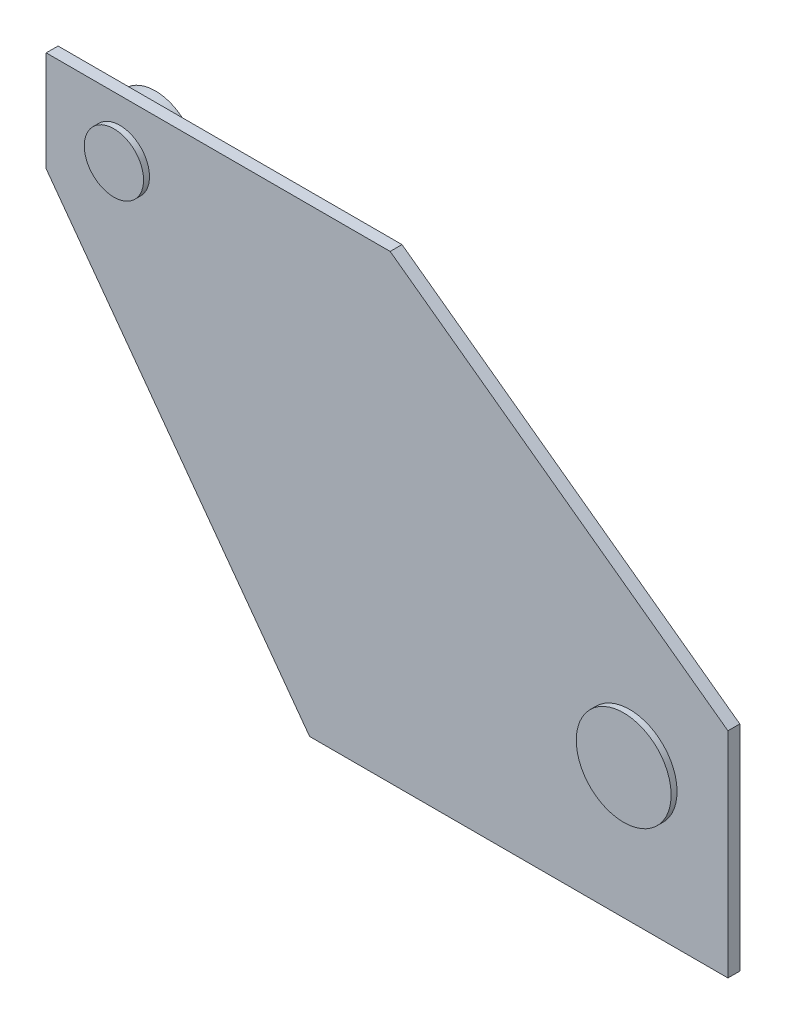
ISO-10303-21;
HEADER;
FILE_DESCRIPTION(('STEP AP214'),'2;1');
FILE_NAME('part.step','',(''),(''),'','','');
FILE_SCHEMA(('AUTOMOTIVE_DESIGN { 1 0 10303 214 1 1 1 1 }'));
ENDSEC;
DATA;
#1=APPLICATION_CONTEXT('core data for automotive mechanical design processes');
#2=APPLICATION_PROTOCOL_DEFINITION('international standard','automotive_design',2000,#1);
#3=PRODUCT_CONTEXT('',#1,'mechanical');
#4=PRODUCT('Part','Part','',(#3));
#5=PRODUCT_RELATED_PRODUCT_CATEGORY('part','',(#4));
#6=PRODUCT_DEFINITION_FORMATION('','',#4);
#7=PRODUCT_DEFINITION_CONTEXT('part definition',#1,'design');
#8=PRODUCT_DEFINITION('design','',#6,#7);
#9=PRODUCT_DEFINITION_SHAPE('','',#8);
#10=(LENGTH_UNIT() NAMED_UNIT(*) SI_UNIT(.MILLI.,.METRE.));
#11=(NAMED_UNIT(*) PLANE_ANGLE_UNIT() SI_UNIT($,.RADIAN.));
#12=(NAMED_UNIT(*) SI_UNIT($,.STERADIAN.) SOLID_ANGLE_UNIT());
#13=UNCERTAINTY_MEASURE_WITH_UNIT(LENGTH_MEASURE(1.E-05),#10,'distance_accuracy_value','');
#14=(GEOMETRIC_REPRESENTATION_CONTEXT(3) GLOBAL_UNCERTAINTY_ASSIGNED_CONTEXT((#13)) GLOBAL_UNIT_ASSIGNED_CONTEXT((#10,
#11,#12)) REPRESENTATION_CONTEXT('',''));
#15=CARTESIAN_POINT('',(0.,0.,0.));
#16=DIRECTION('',(0.,0.,1.));
#17=DIRECTION('',(1.,0.,0.));
#18=AXIS2_PLACEMENT_3D('',#15,#16,#17);
#19=CARTESIAN_POINT('',(179.691190027265,88.518654731376,21.605));
#20=DIRECTION('',(1.,0.,0.));
#21=DIRECTION('',(0.,0.,-1.));
#22=AXIS2_PLACEMENT_3D('',#19,#20,#21);
#23=PLANE('',#22);
#24=DIRECTION('',(0.,0.,-1.));
#25=VECTOR('',#24,1.);
#26=CARTESIAN_POINT('',(179.691190027265,65.5884816943821,21.605));
#27=LINE('',#26,#25);
#28=CARTESIAN_POINT('',(179.691190027265,65.5884816943821,17.145));
#29=VERTEX_POINT('',#28);
#30=CARTESIAN_POINT('',(179.691190027265,65.5884816943821,15.875));
#31=VERTEX_POINT('',#30);
#32=EDGE_CURVE('E139',#29,#31,#27,.T.);
#33=ORIENTED_EDGE('',*,*,#32,.T.);
#34=DIRECTION('',(0.,1.,0.));
#35=VECTOR('',#34,1.);
#36=CARTESIAN_POINT('',(179.691190027265,95.25,15.875));
#37=LINE('',#36,#35);
#38=CARTESIAN_POINT('',(179.691190027265,88.518654731376,15.875));
#39=VERTEX_POINT('',#38);
#40=EDGE_CURVE('E115',#31,#39,#37,.T.);
#41=ORIENTED_EDGE('',*,*,#40,.T.);
#42=DIRECTION('',(0.,0.,-1.));
#43=VECTOR('',#42,1.);
#44=CARTESIAN_POINT('',(179.691190027265,88.518654731376,21.605));
#45=LINE('',#44,#43);
#46=CARTESIAN_POINT('',(179.691190027265,88.518654731376,17.145));
#47=VERTEX_POINT('',#46);
#48=EDGE_CURVE('E43',#47,#39,#45,.T.);
#49=ORIENTED_EDGE('',*,*,#48,.F.);
#50=DIRECTION('',(0.,1.,0.));
#51=VECTOR('',#50,1.);
#52=CARTESIAN_POINT('',(179.691190027265,73.2864974747366,17.145));
#53=LINE('',#52,#51);
#54=EDGE_CURVE('E132',#29,#47,#53,.T.);
#55=ORIENTED_EDGE('',*,*,#54,.F.);
#56=EDGE_LOOP('',(#33,#41,#49,#55));
#57=FACE_BOUND('',#56,.T.);
#58=ADVANCED_FACE('F39',(#57),#23,.T.);
#59=CARTESIAN_POINT('',(143.514301236525,114.889871939466,21.605));
#60=DIRECTION('',(0.589058923049427,0.808090084814713,0.));
#61=DIRECTION('',(-0.808090084814713,0.589058923049427,0.));
#62=AXIS2_PLACEMENT_3D('',#59,#60,#61);
#63=PLANE('',#62);
#64=ORIENTED_EDGE('',*,*,#48,.T.);
#65=DIRECTION('',(-0.808090084814713,0.589058923049427,0.));
#66=VECTOR('',#65,1.);
#67=CARTESIAN_POINT('',(59.1469148995483,176.389651073063,15.875));
#68=LINE('',#67,#66);
#69=CARTESIAN_POINT('',(143.514301236525,114.889871939466,15.875));
#70=VERTEX_POINT('',#69);
#71=EDGE_CURVE('E108',#39,#70,#68,.T.);
#72=ORIENTED_EDGE('',*,*,#71,.T.);
#73=DIRECTION('',(0.,0.,-1.));
#74=VECTOR('',#73,1.);
#75=CARTESIAN_POINT('',(143.514301236525,114.889871939466,21.605));
#76=LINE('',#75,#74);
#77=CARTESIAN_POINT('',(143.514301236525,114.889871939466,17.145));
#78=VERTEX_POINT('',#77);
#79=EDGE_CURVE('E93',#78,#70,#76,.T.);
#80=ORIENTED_EDGE('',*,*,#79,.F.);
#81=DIRECTION('',(-0.808090084814713,0.589058923049427,0.));
#82=VECTOR('',#81,1.);
#83=CARTESIAN_POINT('',(161.167664680989,102.021416486037,17.145));
#84=LINE('',#83,#82);
#85=EDGE_CURVE('E55',#47,#78,#84,.T.);
#86=ORIENTED_EDGE('',*,*,#85,.F.);
#87=EDGE_LOOP('',(#64,#72,#80,#86));
#88=FACE_BOUND('',#87,.T.);
#89=ADVANCED_FACE('F41',(#88),#63,.T.);
#90=CARTESIAN_POINT('',(106.680223984281,114.889871939466,21.605));
#91=DIRECTION('',(0.,1.,0.));
#92=DIRECTION('',(0.,0.,1.));
#93=AXIS2_PLACEMENT_3D('',#90,#91,#92);
#94=PLANE('',#93);
#95=ORIENTED_EDGE('',*,*,#79,.T.);
#96=DIRECTION('',(-1.,0.,0.));
#97=VECTOR('',#96,1.);
#98=CARTESIAN_POINT('',(0.,114.889871939466,15.875));
#99=LINE('',#98,#97);
#100=CARTESIAN_POINT('',(106.680223984281,114.889871939466,15.875));
#101=VERTEX_POINT('',#100);
#102=EDGE_CURVE('E97',#70,#101,#99,.T.);
#103=ORIENTED_EDGE('',*,*,#102,.T.);
#104=DIRECTION('',(0.,0.,-1.));
#105=VECTOR('',#104,1.);
#106=CARTESIAN_POINT('',(106.680223984281,114.889871939466,21.605));
#107=LINE('',#106,#105);
#108=CARTESIAN_POINT('',(106.680223984281,114.889871939466,17.145));
#109=VERTEX_POINT('',#108);
#110=EDGE_CURVE('E102',#109,#101,#107,.T.);
#111=ORIENTED_EDGE('',*,*,#110,.F.);
#112=DIRECTION('',(-1.,0.,0.));
#113=VECTOR('',#112,1.);
#114=CARTESIAN_POINT('',(140.221286591732,114.889871939466,17.145));
#115=LINE('',#114,#113);
#116=EDGE_CURVE('E12',#78,#109,#115,.T.);
#117=ORIENTED_EDGE('',*,*,#116,.F.);
#118=EDGE_LOOP('',(#95,#103,#111,#117));
#119=FACE_BOUND('',#118,.T.);
#120=ADVANCED_FACE('F95',(#119),#94,.T.);
#121=CARTESIAN_POINT('',(106.680223984281,104.130713951506,21.605));
#122=DIRECTION('',(-1.,0.,0.));
#123=DIRECTION('',(0.,0.,1.));
#124=AXIS2_PLACEMENT_3D('',#121,#122,#123);
#125=PLANE('',#124);
#126=ORIENTED_EDGE('',*,*,#110,.T.);
#127=DIRECTION('',(0.,-1.,0.));
#128=VECTOR('',#127,1.);
#129=CARTESIAN_POINT('',(106.680223984281,95.25,15.875));
#130=LINE('',#129,#128);
#131=CARTESIAN_POINT('',(106.680223984281,104.130713951506,15.875));
#132=VERTEX_POINT('',#131);
#133=EDGE_CURVE('E111',#101,#132,#130,.T.);
#134=ORIENTED_EDGE('',*,*,#133,.T.);
#135=DIRECTION('',(0.,0.,-1.));
#136=VECTOR('',#135,1.);
#137=CARTESIAN_POINT('',(106.680223984281,104.130713951506,21.605));
#138=LINE('',#137,#136);
#139=CARTESIAN_POINT('',(106.680223984281,104.130713951506,17.145));
#140=VERTEX_POINT('',#139);
#141=EDGE_CURVE('E101',#140,#132,#138,.T.);
#142=ORIENTED_EDGE('',*,*,#141,.F.);
#143=DIRECTION('',(0.,-1.,0.));
#144=VECTOR('',#143,1.);
#145=CARTESIAN_POINT('',(106.680223984281,73.2864974747366,17.145));
#146=LINE('',#145,#144);
#147=EDGE_CURVE('E48',#109,#140,#146,.T.);
#148=ORIENTED_EDGE('',*,*,#147,.F.);
#149=EDGE_LOOP('',(#126,#134,#142,#148));
#150=FACE_BOUND('',#149,.T.);
#151=ADVANCED_FACE('F179',(#150),#125,.T.);
#152=CARTESIAN_POINT('',(134.890546490372,65.5884816943821,21.605));
#153=DIRECTION('',(-0.80694362065516,-0.590628472970903,0.));
#154=DIRECTION('',(0.590628472970903,-0.80694362065516,0.));
#155=AXIS2_PLACEMENT_3D('',#152,#153,#154);
#156=PLANE('',#155);
#157=ORIENTED_EDGE('',*,*,#141,.T.);
#158=DIRECTION('',(0.590628472970903,-0.80694362065516,0.));
#159=VECTOR('',#158,1.);
#160=CARTESIAN_POINT('',(73.6982647395772,149.192174458732,15.875));
#161=LINE('',#160,#159);
#162=CARTESIAN_POINT('',(134.890546490372,65.5884816943821,15.875));
#163=VERTEX_POINT('',#162);
#164=EDGE_CURVE('E170',#132,#163,#161,.T.);
#165=ORIENTED_EDGE('',*,*,#164,.T.);
#166=DIRECTION('',(0.,0.,-1.));
#167=VECTOR('',#166,1.);
#168=CARTESIAN_POINT('',(134.890546490372,65.5884816943821,21.605));
#169=LINE('',#168,#167);
#170=CARTESIAN_POINT('',(134.890546490372,65.5884816943821,17.145));
#171=VERTEX_POINT('',#170);
#172=EDGE_CURVE('E138',#171,#163,#169,.T.);
#173=ORIENTED_EDGE('',*,*,#172,.F.);
#174=DIRECTION('',(0.590628472970903,-0.80694362065516,0.));
#175=VECTOR('',#174,1.);
#176=CARTESIAN_POINT('',(133.081228314724,68.060454899856,17.145));
#177=LINE('',#176,#175);
#178=EDGE_CURVE('E126',#140,#171,#177,.T.);
#179=ORIENTED_EDGE('',*,*,#178,.F.);
#180=EDGE_LOOP('',(#157,#165,#173,#179));
#181=FACE_BOUND('',#180,.T.);
#182=ADVANCED_FACE('F178',(#181),#156,.T.);
#183=CARTESIAN_POINT('',(179.691190027265,65.5884816943821,21.605));
#184=DIRECTION('',(0.,-1.,0.));
#185=DIRECTION('',(0.,0.,-1.));
#186=AXIS2_PLACEMENT_3D('',#183,#184,#185);
#187=PLANE('',#186);
#188=ORIENTED_EDGE('',*,*,#172,.T.);
#189=DIRECTION('',(1.,0.,0.));
#190=VECTOR('',#189,1.);
#191=CARTESIAN_POINT('',(0.,65.5884816943821,15.875));
#192=LINE('',#191,#190);
#193=EDGE_CURVE('E118',#163,#31,#192,.T.);
#194=ORIENTED_EDGE('',*,*,#193,.T.);
#195=ORIENTED_EDGE('',*,*,#32,.F.);
#196=DIRECTION('',(1.,0.,0.));
#197=VECTOR('',#196,1.);
#198=CARTESIAN_POINT('',(140.221286591732,65.5884816943821,17.145));
#199=LINE('',#198,#197);
#200=EDGE_CURVE('E129',#171,#29,#199,.T.);
#201=ORIENTED_EDGE('',*,*,#200,.F.);
#202=EDGE_LOOP('',(#188,#194,#195,#201));
#203=FACE_BOUND('',#202,.T.);
#204=ADVANCED_FACE('F174',(#203),#187,.T.);
#205=CARTESIAN_POINT('',(114.567134268363,108.936647879628,17.145));
#206=DIRECTION('',(0.,0.,1.));
#207=DIRECTION('',(1.,0.,0.));
#208=AXIS2_PLACEMENT_3D('',#205,#206,#207);
#209=PLANE('',#208);
#210=CARTESIAN_POINT('',(169.162580271859,80.1556220841023,17.145));
#211=DIRECTION('',(0.,0.,-1.));
#212=DIRECTION('',(1.,0.,0.));
#213=AXIS2_PLACEMENT_3D('',#210,#211,#212);
#214=CIRCLE('',#213,5.07999999999999);
#215=CARTESIAN_POINT('',(169.162580271859,75.0756220841023,17.145));
#216=VERTEX_POINT('',#215);
#217=EDGE_CURVE('E390',#216,#216,#214,.T.);
#218=ORIENTED_EDGE('',*,*,#217,.T.);
#219=EDGE_LOOP('',(#218));
#220=FACE_BOUND('',#219,.T.);
#221=CARTESIAN_POINT('',(114.567134268363,108.936647879628,17.145));
#222=DIRECTION('',(0.,0.,-1.));
#223=DIRECTION('',(1.,0.,0.));
#224=AXIS2_PLACEMENT_3D('',#221,#222,#223);
#225=CIRCLE('',#224,3.175);
#226=CARTESIAN_POINT('',(114.567134268363,105.761647879628,17.145));
#227=VERTEX_POINT('',#226);
#228=EDGE_CURVE('E153',#227,#227,#225,.T.);
#229=ORIENTED_EDGE('',*,*,#228,.T.);
#230=EDGE_LOOP('',(#229));
#231=FACE_BOUND('',#230,.T.);
#232=ORIENTED_EDGE('',*,*,#54,.T.);
#233=ORIENTED_EDGE('',*,*,#85,.T.);
#234=ORIENTED_EDGE('',*,*,#116,.T.);
#235=ORIENTED_EDGE('',*,*,#147,.T.);
#236=ORIENTED_EDGE('',*,*,#178,.T.);
#237=ORIENTED_EDGE('',*,*,#200,.T.);
#238=EDGE_LOOP('',(#232,#233,#234,#235,#236,#237));
#239=FACE_BOUND('',#238,.T.);
#240=ADVANCED_FACE('F176',(#220,#231,#239),#209,.T.);
#241=CARTESIAN_POINT('',(0.,95.25,16.78));
#242=DIRECTION('',(0.,0.,1.));
#243=DIRECTION('',(1.,0.,0.));
#244=AXIS2_PLACEMENT_3D('',#241,#242,#243);
#245=PLANE('',#244);
#246=CARTESIAN_POINT('',(114.567134268363,108.936647879628,16.78));
#247=DIRECTION('',(0.,0.,1.));
#248=DIRECTION('',(1.,0.,0.));
#249=AXIS2_PLACEMENT_3D('',#246,#247,#248);
#250=CIRCLE('',#249,1.925);
#251=CARTESIAN_POINT('',(116.492134268363,108.936647879628,16.78));
#252=VERTEX_POINT('',#251);
#253=EDGE_CURVE('E161',#252,#252,#250,.F.);
#254=ORIENTED_EDGE('',*,*,#253,.T.);
#255=EDGE_LOOP('',(#254));
#256=FACE_BOUND('',#255,.T.);
#257=ADVANCED_FACE('F190',(#256),#245,.F.);
#258=CARTESIAN_POINT('',(0.,95.25,16.78));
#259=DIRECTION('',(0.,0.,1.));
#260=DIRECTION('',(1.,0.,0.));
#261=AXIS2_PLACEMENT_3D('',#258,#259,#260);
#262=PLANE('',#261);
#263=CARTESIAN_POINT('',(169.162580271859,80.1556220841023,16.78));
#264=DIRECTION('',(0.,0.,1.));
#265=DIRECTION('',(1.,0.,0.));
#266=AXIS2_PLACEMENT_3D('',#263,#264,#265);
#267=CIRCLE('',#266,1.92500000000002);
#268=CARTESIAN_POINT('',(171.087580271859,80.1556220841023,16.78));
#269=VERTEX_POINT('',#268);
#270=EDGE_CURVE('E162',#269,#269,#267,.F.);
#271=ORIENTED_EDGE('',*,*,#270,.T.);
#272=EDGE_LOOP('',(#271));
#273=FACE_BOUND('',#272,.T.);
#274=ADVANCED_FACE('F197',(#273),#262,.F.);
#275=CARTESIAN_POINT('',(114.567134268363,108.936647879628,23.2247222151364));
#276=DIRECTION('',(0.,0.,-1.));
#277=DIRECTION('',(-1.,0.,0.));
#278=AXIS2_PLACEMENT_3D('',#275,#276,#277);
#279=CYLINDRICAL_SURFACE('',#278,1.925);
#280=ORIENTED_EDGE('',*,*,#253,.F.);
#281=EDGE_LOOP('',(#280));
#282=FACE_BOUND('',#281,.T.);
#283=CARTESIAN_POINT('',(114.567134268363,108.936647879628,13.335));
#284=DIRECTION('',(0.,0.,-1.));
#285=DIRECTION('',(-1.,0.,0.));
#286=AXIS2_PLACEMENT_3D('',#283,#284,#285);
#287=CIRCLE('',#286,1.925);
#288=CARTESIAN_POINT('',(112.642134268363,108.936647879628,13.335));
#289=VERTEX_POINT('',#288);
#290=EDGE_CURVE('E143',#289,#289,#287,.T.);
#291=ORIENTED_EDGE('',*,*,#290,.T.);
#292=EDGE_LOOP('',(#291));
#293=FACE_BOUND('',#292,.T.);
#294=ADVANCED_FACE('F285',(#282,#293),#279,.F.);
#295=CARTESIAN_POINT('',(169.162580271859,80.1556220841023,23.2247222151364));
#296=DIRECTION('',(0.,0.,-1.));
#297=DIRECTION('',(-1.,0.,0.));
#298=AXIS2_PLACEMENT_3D('',#295,#296,#297);
#299=CYLINDRICAL_SURFACE('',#298,1.92500000000002);
#300=ORIENTED_EDGE('',*,*,#270,.F.);
#301=EDGE_LOOP('',(#300));
#302=FACE_BOUND('',#301,.T.);
#303=CARTESIAN_POINT('',(169.162580271859,80.1556220841023,13.335));
#304=DIRECTION('',(0.,0.,-1.));
#305=DIRECTION('',(-1.,0.,0.));
#306=AXIS2_PLACEMENT_3D('',#303,#304,#305);
#307=CIRCLE('',#306,1.92500000000002);
#308=CARTESIAN_POINT('',(167.237580271859,80.1556220841023,13.335));
#309=VERTEX_POINT('',#308);
#310=EDGE_CURVE('E150',#309,#309,#307,.T.);
#311=ORIENTED_EDGE('',*,*,#310,.T.);
#312=EDGE_LOOP('',(#311));
#313=FACE_BOUND('',#312,.T.);
#314=ADVANCED_FACE('F295',(#302,#313),#299,.F.);
#315=CARTESIAN_POINT('',(114.567134268363,108.936647879628,13.335));
#316=DIRECTION('',(0.,0.,-1.));
#317=DIRECTION('',(-1.,0.,0.));
#318=AXIS2_PLACEMENT_3D('',#315,#316,#317);
#319=PLANE('',#318);
#320=CARTESIAN_POINT('',(114.567134268363,108.936647879628,13.335));
#321=DIRECTION('',(0.,0.,-1.));
#322=DIRECTION('',(-1.,0.,0.));
#323=AXIS2_PLACEMENT_3D('',#320,#321,#322);
#324=CIRCLE('',#323,4.465);
#325=CARTESIAN_POINT('',(110.102134268363,108.936647879628,13.335));
#326=VERTEX_POINT('',#325);
#327=EDGE_CURVE('E145',#326,#326,#324,.T.);
#328=ORIENTED_EDGE('',*,*,#327,.T.);
#329=EDGE_LOOP('',(#328));
#330=FACE_BOUND('',#329,.T.);
#331=ORIENTED_EDGE('',*,*,#290,.F.);
#332=EDGE_LOOP('',(#331));
#333=FACE_BOUND('',#332,.T.);
#334=ADVANCED_FACE('F306',(#330,#333),#319,.T.);
#335=CARTESIAN_POINT('',(169.162580271859,80.1556220841023,13.335));
#336=DIRECTION('',(0.,0.,-1.));
#337=DIRECTION('',(-1.,0.,0.));
#338=AXIS2_PLACEMENT_3D('',#335,#336,#337);
#339=PLANE('',#338);
#340=CARTESIAN_POINT('',(169.162580271859,80.1556220841023,13.335));
#341=DIRECTION('',(0.,0.,-1.));
#342=DIRECTION('',(-1.,0.,0.));
#343=AXIS2_PLACEMENT_3D('',#340,#341,#342);
#344=CIRCLE('',#343,4.46500000000002);
#345=CARTESIAN_POINT('',(164.697580271859,80.1556220841023,13.335));
#346=VERTEX_POINT('',#345);
#347=EDGE_CURVE('E158',#346,#346,#344,.T.);
#348=ORIENTED_EDGE('',*,*,#347,.T.);
#349=EDGE_LOOP('',(#348));
#350=FACE_BOUND('',#349,.T.);
#351=ORIENTED_EDGE('',*,*,#310,.F.);
#352=EDGE_LOOP('',(#351));
#353=FACE_BOUND('',#352,.T.);
#354=ADVANCED_FACE('F320',(#350,#353),#339,.T.);
#355=CARTESIAN_POINT('',(114.567134268363,108.936647879628,13.335));
#356=DIRECTION('',(0.,0.,1.));
#357=DIRECTION('',(1.,0.,0.));
#358=AXIS2_PLACEMENT_3D('',#355,#356,#357);
#359=CYLINDRICAL_SURFACE('',#358,4.465);
#360=ORIENTED_EDGE('',*,*,#327,.F.);
#361=EDGE_LOOP('',(#360));
#362=FACE_BOUND('',#361,.T.);
#363=CARTESIAN_POINT('',(114.567134268363,108.936647879628,15.875));
#364=DIRECTION('',(0.,0.,1.));
#365=DIRECTION('',(1.,0.,0.));
#366=AXIS2_PLACEMENT_3D('',#363,#364,#365);
#367=CIRCLE('',#366,4.465);
#368=CARTESIAN_POINT('',(119.032134268363,108.936647879628,15.875));
#369=VERTEX_POINT('',#368);
#370=EDGE_CURVE('E116',#369,#369,#367,.F.);
#371=ORIENTED_EDGE('',*,*,#370,.T.);
#372=EDGE_LOOP('',(#371));
#373=FACE_BOUND('',#372,.T.);
#374=ADVANCED_FACE('F215',(#362,#373),#359,.T.);
#375=CARTESIAN_POINT('',(169.162580271859,80.1556220841023,13.335));
#376=DIRECTION('',(0.,0.,1.));
#377=DIRECTION('',(1.,0.,0.));
#378=AXIS2_PLACEMENT_3D('',#375,#376,#377);
#379=CYLINDRICAL_SURFACE('',#378,4.46500000000002);
#380=ORIENTED_EDGE('',*,*,#347,.F.);
#381=EDGE_LOOP('',(#380));
#382=FACE_BOUND('',#381,.T.);
#383=CARTESIAN_POINT('',(169.162580271859,80.1556220841023,15.875));
#384=DIRECTION('',(0.,0.,1.));
#385=DIRECTION('',(1.,0.,0.));
#386=AXIS2_PLACEMENT_3D('',#383,#384,#385);
#387=CIRCLE('',#386,4.46500000000002);
#388=CARTESIAN_POINT('',(173.627580271859,80.1556220841023,15.875));
#389=VERTEX_POINT('',#388);
#390=EDGE_CURVE('E121',#389,#389,#387,.F.);
#391=ORIENTED_EDGE('',*,*,#390,.T.);
#392=EDGE_LOOP('',(#391));
#393=FACE_BOUND('',#392,.T.);
#394=ADVANCED_FACE('F206',(#382,#393),#379,.T.);
#395=CARTESIAN_POINT('',(0.,95.25,15.875));
#396=DIRECTION('',(0.,0.,1.));
#397=DIRECTION('',(1.,0.,0.));
#398=AXIS2_PLACEMENT_3D('',#395,#396,#397);
#399=PLANE('',#398);
#400=ORIENTED_EDGE('',*,*,#390,.F.);
#401=EDGE_LOOP('',(#400));
#402=FACE_BOUND('',#401,.T.);
#403=ORIENTED_EDGE('',*,*,#370,.F.);
#404=EDGE_LOOP('',(#403));
#405=FACE_BOUND('',#404,.T.);
#406=ORIENTED_EDGE('',*,*,#71,.F.);
#407=ORIENTED_EDGE('',*,*,#40,.F.);
#408=ORIENTED_EDGE('',*,*,#193,.F.);
#409=ORIENTED_EDGE('',*,*,#164,.F.);
#410=ORIENTED_EDGE('',*,*,#133,.F.);
#411=ORIENTED_EDGE('',*,*,#102,.F.);
#412=EDGE_LOOP('',(#406,#407,#408,#409,#410,#411));
#413=FACE_BOUND('',#412,.T.);
#414=ADVANCED_FACE('F106',(#402,#405,#413),#399,.F.);
#415=CARTESIAN_POINT('',(0.,95.25,17.78));
#416=DIRECTION('',(0.,0.,1.));
#417=DIRECTION('',(1.,0.,0.));
#418=AXIS2_PLACEMENT_3D('',#415,#416,#417);
#419=PLANE('',#418);
#420=CARTESIAN_POINT('',(114.567134268363,108.936647879628,17.78));
#421=DIRECTION('',(0.,0.,1.));
#422=DIRECTION('',(1.,0.,0.));
#423=AXIS2_PLACEMENT_3D('',#420,#421,#422);
#424=CIRCLE('',#423,3.175);
#425=CARTESIAN_POINT('',(114.567134268363,105.761647879628,17.78));
#426=VERTEX_POINT('',#425);
#427=EDGE_CURVE('E136',#426,#426,#424,.F.);
#428=ORIENTED_EDGE('',*,*,#427,.F.);
#429=EDGE_LOOP('',(#428));
#430=FACE_BOUND('',#429,.T.);
#431=ADVANCED_FACE('F188',(#430),#419,.T.);
#432=CARTESIAN_POINT('',(114.567134268363,108.936647879628,17.145));
#433=DIRECTION('',(0.,0.,1.));
#434=DIRECTION('',(0.,-1.,0.));
#435=AXIS2_PLACEMENT_3D('',#432,#433,#434);
#436=CYLINDRICAL_SURFACE('',#435,3.175);
#437=CARTESIAN_POINT('',(114.567134268363,105.761647879628,17.145));
#438=CARTESIAN_POINT('',(114.567134268363,105.761647879628,17.1516145833333));
#439=CARTESIAN_POINT('',(114.567134268363,105.761647879628,17.1582291666667));
#440=CARTESIAN_POINT('',(114.567134268363,105.761647879628,17.1714583333333));
#441=CARTESIAN_POINT('',(114.567134268363,105.761647879628,17.1780729166666));
#442=CARTESIAN_POINT('',(114.567134268363,105.761647879628,17.1913020833333));
#443=CARTESIAN_POINT('',(114.567134268363,105.761647879628,17.1979166666667));
#444=CARTESIAN_POINT('',(114.567134268363,105.761647879628,17.2111458333333));
#445=CARTESIAN_POINT('',(114.567134268363,105.761647879628,17.2177604166666));
#446=CARTESIAN_POINT('',(114.567134268363,105.761647879628,17.2309895833333));
#447=CARTESIAN_POINT('',(114.567134268363,105.761647879628,17.2376041666666));
#448=CARTESIAN_POINT('',(114.567134268363,105.761647879628,17.2508333333333));
#449=CARTESIAN_POINT('',(114.567134268363,105.761647879628,17.2574479166666));
#450=CARTESIAN_POINT('',(114.567134268363,105.761647879628,17.2706770833333));
#451=CARTESIAN_POINT('',(114.567134268363,105.761647879628,17.2772916666667));
#452=CARTESIAN_POINT('',(114.567134268363,105.761647879628,17.2905208333333));
#453=CARTESIAN_POINT('',(114.567134268363,105.761647879628,17.2971354166667));
#454=CARTESIAN_POINT('',(114.567134268363,105.761647879628,17.3103645833333));
#455=CARTESIAN_POINT('',(114.567134268363,105.761647879628,17.3169791666667));
#456=CARTESIAN_POINT('',(114.567134268363,105.761647879628,17.3302083333333));
#457=CARTESIAN_POINT('',(114.567134268363,105.761647879628,17.3368229166667));
#458=CARTESIAN_POINT('',(114.567134268363,105.761647879628,17.3500520833333));
#459=CARTESIAN_POINT('',(114.567134268363,105.761647879628,17.3566666666667));
#460=CARTESIAN_POINT('',(114.567134268363,105.761647879628,17.3698958333333));
#461=CARTESIAN_POINT('',(114.567134268363,105.761647879628,17.3765104166667));
#462=CARTESIAN_POINT('',(114.567134268363,105.761647879628,17.3897395833333));
#463=CARTESIAN_POINT('',(114.567134268363,105.761647879628,17.3963541666667));
#464=CARTESIAN_POINT('',(114.567134268363,105.761647879628,17.4095833333333));
#465=CARTESIAN_POINT('',(114.567134268363,105.761647879628,17.4161979166667));
#466=CARTESIAN_POINT('',(114.567134268363,105.761647879628,17.4294270833333));
#467=CARTESIAN_POINT('',(114.567134268363,105.761647879628,17.4360416666667));
#468=CARTESIAN_POINT('',(114.567134268363,105.761647879628,17.4492708333333));
#469=CARTESIAN_POINT('',(114.567134268363,105.761647879628,17.4558854166667));
#470=CARTESIAN_POINT('',(114.567134268363,105.761647879628,17.4691145833333));
#471=CARTESIAN_POINT('',(114.567134268363,105.761647879628,17.4757291666667));
#472=CARTESIAN_POINT('',(114.567134268363,105.761647879628,17.4889583333333));
#473=CARTESIAN_POINT('',(114.567134268363,105.761647879628,17.4955729166667));
#474=CARTESIAN_POINT('',(114.567134268363,105.761647879628,17.5088020833333));
#475=CARTESIAN_POINT('',(114.567134268363,105.761647879628,17.5154166666667));
#476=CARTESIAN_POINT('',(114.567134268363,105.761647879628,17.5286458333333));
#477=CARTESIAN_POINT('',(114.567134268363,105.761647879628,17.5352604166667));
#478=CARTESIAN_POINT('',(114.567134268363,105.761647879628,17.5484895833333));
#479=CARTESIAN_POINT('',(114.567134268363,105.761647879628,17.5551041666667));
#480=CARTESIAN_POINT('',(114.567134268363,105.761647879628,17.5683333333333));
#481=CARTESIAN_POINT('',(114.567134268363,105.761647879628,17.5749479166667));
#482=CARTESIAN_POINT('',(114.567134268363,105.761647879628,17.5881770833333));
#483=CARTESIAN_POINT('',(114.567134268363,105.761647879628,17.5947916666667));
#484=CARTESIAN_POINT('',(114.567134268363,105.761647879628,17.6080208333333));
#485=CARTESIAN_POINT('',(114.567134268363,105.761647879628,17.6146354166667));
#486=CARTESIAN_POINT('',(114.567134268363,105.761647879628,17.6278645833333));
#487=CARTESIAN_POINT('',(114.567134268363,105.761647879628,17.6344791666667));
#488=CARTESIAN_POINT('',(114.567134268363,105.761647879628,17.6477083333333));
#489=CARTESIAN_POINT('',(114.567134268363,105.761647879628,17.6543229166667));
#490=CARTESIAN_POINT('',(114.567134268363,105.761647879628,17.6675520833333));
#491=CARTESIAN_POINT('',(114.567134268363,105.761647879628,17.6741666666667));
#492=CARTESIAN_POINT('',(114.567134268363,105.761647879628,17.6873958333333));
#493=CARTESIAN_POINT('',(114.567134268363,105.761647879628,17.6940104166667));
#494=CARTESIAN_POINT('',(114.567134268363,105.761647879628,17.7072395833333));
#495=CARTESIAN_POINT('',(114.567134268363,105.761647879628,17.7138541666667));
#496=CARTESIAN_POINT('',(114.567134268363,105.761647879628,17.7270833333333));
#497=CARTESIAN_POINT('',(114.567134268363,105.761647879628,17.7336979166667));
#498=CARTESIAN_POINT('',(114.567134268363,105.761647879628,17.7469270833333));
#499=CARTESIAN_POINT('',(114.567134268363,105.761647879628,17.7535416666667));
#500=CARTESIAN_POINT('',(114.567134268363,105.761647879628,17.7667708333333));
#501=CARTESIAN_POINT('',(114.567134268363,105.761647879628,17.7733854166667));
#502=CARTESIAN_POINT('',(114.567134268363,105.761647879628,17.78));
#503=B_SPLINE_CURVE_WITH_KNOTS('',3,(#437,#438,#439,#440,#441,#442,#443,#444,#445,#446,#447,
#448,#449,#450,#451,#452,#453,#454,#455,#456,#457,#458,#459,#460,#461,#462,#463,#464,#465,#466,
#467,#468,#469,#470,#471,#472,#473,#474,#475,#476,#477,#478,#479,#480,#481,#482,#483,#484,#485,
#486,#487,#488,#489,#490,#491,#492,#493,#494,#495,#496,#497,#498,#499,#500,#501,#502),
.UNSPECIFIED.,.F.,.F.,(4,2,2,2,2,2,2,2,2,2,2,2,2,2,2,2,2,2,2,2,2,2,2,2,2,2,2,2,2,2,2,2,4),(0.,
0.0198437499999982,0.0396874999999998,0.0595312500000014,0.0793749999999996,0.0992187500000012,
0.119062500000003,0.138906250000001,0.158750000000003,0.178593750000004,0.198437500000002,
0.218281250000004,0.238125000000006,0.257968750000004,0.277812500000005,0.297656250000007,
0.317500000000009,0.337343750000007,0.357187500000009,0.37703125000001,0.396875000000008,
0.41671875000001,0.436562500000012,0.45640625000001,0.476250000000011,0.496093750000013,
0.515937500000011,0.535781250000013,0.555625000000014,0.575468750000013,0.595312500000014,
0.615156250000016,0.635000000000018),.UNSPECIFIED.);
#504=EDGE_CURVE('BSEAM212',#227,#426,#503,.T.);
#505=ORIENTED_EDGE('',*,*,#228,.F.);
#506=ORIENTED_EDGE('',*,*,#427,.T.);
#507=ORIENTED_EDGE('',*,*,#504,.T.);
#508=ORIENTED_EDGE('',*,*,#504,.F.);
#509=EDGE_LOOP('',(#505,#507,#506,#508));
#510=FACE_BOUND('',#509,.T.);
#511=ADVANCED_FACE('F212',(#510),#436,.T.);
#512=CARTESIAN_POINT('',(0.,95.25,17.78));
#513=DIRECTION('',(0.,0.,1.));
#514=DIRECTION('',(1.,0.,0.));
#515=AXIS2_PLACEMENT_3D('',#512,#513,#514);
#516=PLANE('',#515);
#517=CARTESIAN_POINT('',(169.162580271859,80.1556220841023,17.78));
#518=DIRECTION('',(0.,0.,1.));
#519=DIRECTION('',(1.,0.,0.));
#520=AXIS2_PLACEMENT_3D('',#517,#518,#519);
#521=CIRCLE('',#520,5.07999999999999);
#522=CARTESIAN_POINT('',(169.162580271859,75.0756220841023,17.78));
#523=VERTEX_POINT('',#522);
#524=EDGE_CURVE('E393',#523,#523,#521,.F.);
#525=ORIENTED_EDGE('',*,*,#524,.F.);
#526=EDGE_LOOP('',(#525));
#527=FACE_BOUND('',#526,.T.);
#528=ADVANCED_FACE('F362',(#527),#516,.T.);
#529=CARTESIAN_POINT('',(169.162580271859,80.1556220841023,17.145));
#530=DIRECTION('',(0.,0.,1.));
#531=DIRECTION('',(0.,-1.,0.));
#532=AXIS2_PLACEMENT_3D('',#529,#530,#531);
#533=CYLINDRICAL_SURFACE('',#532,5.07999999999999);
#534=CARTESIAN_POINT('',(169.162580271859,75.0756220841023,17.145));
#535=CARTESIAN_POINT('',(169.162580271859,75.0756220841023,17.1516145833333));
#536=CARTESIAN_POINT('',(169.162580271859,75.0756220841023,17.1582291666667));
#537=CARTESIAN_POINT('',(169.162580271859,75.0756220841023,17.1714583333333));
#538=CARTESIAN_POINT('',(169.162580271859,75.0756220841023,17.1780729166667));
#539=CARTESIAN_POINT('',(169.162580271859,75.0756220841023,17.1913020833333));
#540=CARTESIAN_POINT('',(169.162580271859,75.0756220841023,17.1979166666667));
#541=CARTESIAN_POINT('',(169.162580271859,75.0756220841023,17.2111458333333));
#542=CARTESIAN_POINT('',(169.162580271859,75.0756220841023,17.2177604166667));
#543=CARTESIAN_POINT('',(169.162580271859,75.0756220841023,17.2309895833333));
#544=CARTESIAN_POINT('',(169.162580271859,75.0756220841023,17.2376041666667));
#545=CARTESIAN_POINT('',(169.162580271859,75.0756220841023,17.2508333333333));
#546=CARTESIAN_POINT('',(169.162580271859,75.0756220841023,17.2574479166667));
#547=CARTESIAN_POINT('',(169.162580271859,75.0756220841023,17.2706770833333));
#548=CARTESIAN_POINT('',(169.162580271859,75.0756220841023,17.2772916666667));
#549=CARTESIAN_POINT('',(169.162580271859,75.0756220841023,17.2905208333333));
#550=CARTESIAN_POINT('',(169.162580271859,75.0756220841023,17.2971354166667));
#551=CARTESIAN_POINT('',(169.162580271859,75.0756220841023,17.3103645833333));
#552=CARTESIAN_POINT('',(169.162580271859,75.0756220841023,17.3169791666667));
#553=CARTESIAN_POINT('',(169.162580271859,75.0756220841023,17.3302083333333));
#554=CARTESIAN_POINT('',(169.162580271859,75.0756220841023,17.3368229166667));
#555=CARTESIAN_POINT('',(169.162580271859,75.0756220841023,17.3500520833333));
#556=CARTESIAN_POINT('',(169.162580271859,75.0756220841023,17.3566666666667));
#557=CARTESIAN_POINT('',(169.162580271859,75.0756220841023,17.3698958333333));
#558=CARTESIAN_POINT('',(169.162580271859,75.0756220841023,17.3765104166667));
#559=CARTESIAN_POINT('',(169.162580271859,75.0756220841023,17.3897395833333));
#560=CARTESIAN_POINT('',(169.162580271859,75.0756220841023,17.3963541666667));
#561=CARTESIAN_POINT('',(169.162580271859,75.0756220841023,17.4095833333333));
#562=CARTESIAN_POINT('',(169.162580271859,75.0756220841023,17.4161979166667));
#563=CARTESIAN_POINT('',(169.162580271859,75.0756220841023,17.4294270833333));
#564=CARTESIAN_POINT('',(169.162580271859,75.0756220841023,17.4360416666667));
#565=CARTESIAN_POINT('',(169.162580271859,75.0756220841023,17.4492708333333));
#566=CARTESIAN_POINT('',(169.162580271859,75.0756220841023,17.4558854166667));
#567=CARTESIAN_POINT('',(169.162580271859,75.0756220841023,17.4691145833333));
#568=CARTESIAN_POINT('',(169.162580271859,75.0756220841023,17.4757291666667));
#569=CARTESIAN_POINT('',(169.162580271859,75.0756220841023,17.4889583333333));
#570=CARTESIAN_POINT('',(169.162580271859,75.0756220841023,17.4955729166667));
#571=CARTESIAN_POINT('',(169.162580271859,75.0756220841023,17.5088020833333));
#572=CARTESIAN_POINT('',(169.162580271859,75.0756220841023,17.5154166666667));
#573=CARTESIAN_POINT('',(169.162580271859,75.0756220841023,17.5286458333333));
#574=CARTESIAN_POINT('',(169.162580271859,75.0756220841023,17.5352604166667));
#575=CARTESIAN_POINT('',(169.162580271859,75.0756220841023,17.5484895833333));
#576=CARTESIAN_POINT('',(169.162580271859,75.0756220841023,17.5551041666667));
#577=CARTESIAN_POINT('',(169.162580271859,75.0756220841023,17.5683333333333));
#578=CARTESIAN_POINT('',(169.162580271859,75.0756220841023,17.5749479166667));
#579=CARTESIAN_POINT('',(169.162580271859,75.0756220841023,17.5881770833333));
#580=CARTESIAN_POINT('',(169.162580271859,75.0756220841023,17.5947916666667));
#581=CARTESIAN_POINT('',(169.162580271859,75.0756220841023,17.6080208333333));
#582=CARTESIAN_POINT('',(169.162580271859,75.0756220841023,17.6146354166667));
#583=CARTESIAN_POINT('',(169.162580271859,75.0756220841023,17.6278645833333));
#584=CARTESIAN_POINT('',(169.162580271859,75.0756220841023,17.6344791666667));
#585=CARTESIAN_POINT('',(169.162580271859,75.0756220841023,17.6477083333333));
#586=CARTESIAN_POINT('',(169.162580271859,75.0756220841023,17.6543229166667));
#587=CARTESIAN_POINT('',(169.162580271859,75.0756220841023,17.6675520833333));
#588=CARTESIAN_POINT('',(169.162580271859,75.0756220841023,17.6741666666667));
#589=CARTESIAN_POINT('',(169.162580271859,75.0756220841023,17.6873958333333));
#590=CARTESIAN_POINT('',(169.162580271859,75.0756220841023,17.6940104166667));
#591=CARTESIAN_POINT('',(169.162580271859,75.0756220841023,17.7072395833333));
#592=CARTESIAN_POINT('',(169.162580271859,75.0756220841023,17.7138541666667));
#593=CARTESIAN_POINT('',(169.162580271859,75.0756220841023,17.7270833333333));
#594=CARTESIAN_POINT('',(169.162580271859,75.0756220841023,17.7336979166667));
#595=CARTESIAN_POINT('',(169.162580271859,75.0756220841023,17.7469270833333));
#596=CARTESIAN_POINT('',(169.162580271859,75.0756220841023,17.7535416666667));
#597=CARTESIAN_POINT('',(169.162580271859,75.0756220841023,17.7667708333333));
#598=CARTESIAN_POINT('',(169.162580271859,75.0756220841023,17.7733854166667));
#599=CARTESIAN_POINT('',(169.162580271859,75.0756220841023,17.78));
#600=B_SPLINE_CURVE_WITH_KNOTS('',3,(#534,#535,#536,#537,#538,#539,#540,#541,#542,#543,#544,
#545,#546,#547,#548,#549,#550,#551,#552,#553,#554,#555,#556,#557,#558,#559,#560,#561,#562,#563,
#564,#565,#566,#567,#568,#569,#570,#571,#572,#573,#574,#575,#576,#577,#578,#579,#580,#581,#582,
#583,#584,#585,#586,#587,#588,#589,#590,#591,#592,#593,#594,#595,#596,#597,#598,#599),
.UNSPECIFIED.,.F.,.F.,(4,2,2,2,2,2,2,2,2,2,2,2,2,2,2,2,2,2,2,2,2,2,2,2,2,2,2,2,2,2,2,2,4),(0.,
0.0198437499999982,0.0396874999999998,0.059531249999998,0.0793749999999996,0.0992187500000012,
0.119062499999999,0.138906250000001,0.158750000000003,0.178593750000001,0.198437500000002,
0.218281250000001,0.238125000000002,0.257968750000004,0.277812500000002,0.297656250000004,
0.317500000000005,0.337343750000003,0.357187500000005,0.377031250000003,0.396875000000005,
0.416718750000006,0.436562500000005,0.456406250000006,0.476250000000008,0.496093750000006,
0.515937500000008,0.535781250000006,0.555625000000007,0.575468750000009,0.595312500000007,
0.615156250000009,0.635000000000011),.UNSPECIFIED.);
#601=EDGE_CURVE('BSEAM365',#216,#523,#600,.T.);
#602=ORIENTED_EDGE('',*,*,#217,.F.);
#603=ORIENTED_EDGE('',*,*,#524,.T.);
#604=ORIENTED_EDGE('',*,*,#601,.T.);
#605=ORIENTED_EDGE('',*,*,#601,.F.);
#606=EDGE_LOOP('',(#602,#604,#603,#605));
#607=FACE_BOUND('',#606,.T.);
#608=ADVANCED_FACE('F365',(#607),#533,.T.);
#609=CLOSED_SHELL('',(#58,#89,#120,#151,#182,#204,#240,#257,#274,#294,#314,#334,#354,#374,#394,
#414,#431,#511,#528,#608));
#610=MANIFOLD_SOLID_BREP('B2',#609);
#611=ADVANCED_BREP_SHAPE_REPRESENTATION('',(#18,#610),#14);
#612=SHAPE_DEFINITION_REPRESENTATION(#9,#611);
ENDSEC;
END-ISO-10303-21;
